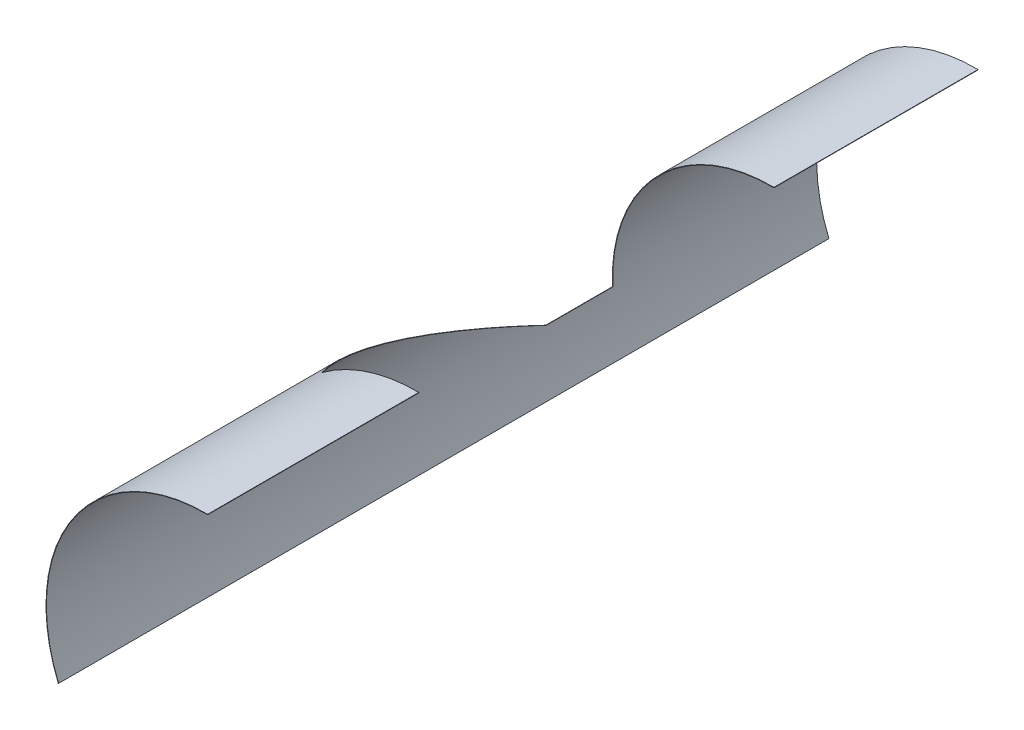
ISO-10303-21;
HEADER;
FILE_DESCRIPTION(('STEP AP214'),'2;1');
FILE_NAME('part.step','',(''),(''),'','','');
FILE_SCHEMA(('AUTOMOTIVE_DESIGN { 1 0 10303 214 1 1 1 1 }'));
ENDSEC;
DATA;
#1=APPLICATION_CONTEXT('core data for automotive mechanical design processes');
#2=APPLICATION_PROTOCOL_DEFINITION('international standard','automotive_design',2000,#1);
#3=PRODUCT_CONTEXT('',#1,'mechanical');
#4=PRODUCT('Part','Part','',(#3));
#5=PRODUCT_RELATED_PRODUCT_CATEGORY('part','',(#4));
#6=PRODUCT_DEFINITION_FORMATION('','',#4);
#7=PRODUCT_DEFINITION_CONTEXT('part definition',#1,'design');
#8=PRODUCT_DEFINITION('design','',#6,#7);
#9=PRODUCT_DEFINITION_SHAPE('','',#8);
#10=(LENGTH_UNIT() NAMED_UNIT(*) SI_UNIT(.MILLI.,.METRE.));
#11=(NAMED_UNIT(*) PLANE_ANGLE_UNIT() SI_UNIT($,.RADIAN.));
#12=(NAMED_UNIT(*) SI_UNIT($,.STERADIAN.) SOLID_ANGLE_UNIT());
#13=UNCERTAINTY_MEASURE_WITH_UNIT(LENGTH_MEASURE(1.E-05),#10,'distance_accuracy_value','');
#14=(GEOMETRIC_REPRESENTATION_CONTEXT(3) GLOBAL_UNCERTAINTY_ASSIGNED_CONTEXT((#13)) GLOBAL_UNIT_ASSIGNED_CONTEXT((#10,
#11,#12)) REPRESENTATION_CONTEXT('',''));
#15=CARTESIAN_POINT('',(0.,0.,0.));
#16=DIRECTION('',(0.,0.,1.));
#17=DIRECTION('',(1.,0.,0.));
#18=AXIS2_PLACEMENT_3D('',#15,#16,#17);
#19=CARTESIAN_POINT('',(0.,1.38777878078145E-13,2670.88598128334));
#20=DIRECTION('',(0.,0.,-1.));
#21=DIRECTION('',(1.,0.,0.));
#22=AXIS2_PLACEMENT_3D('',#19,#20,#21);
#23=CYLINDRICAL_SURFACE('',#22,406.);
#24=CARTESIAN_POINT('',(0.,1.38777878078145E-13,9.84573388113086));
#25=DIRECTION('',(0.,0.,1.));
#26=DIRECTION('',(1.,0.,0.));
#27=AXIS2_PLACEMENT_3D('',#24,#25,#26);
#28=CIRCLE('',#27,406.);
#29=CARTESIAN_POINT('',(4.99999999999997,405.969210655193,9.84573388113086));
#30=VERTEX_POINT('',#29);
#31=CARTESIAN_POINT('',(-374.794878018808,-156.092278511356,9.84573388113086));
#32=VERTEX_POINT('',#31);
#33=EDGE_CURVE('E131',#30,#32,#28,.T.);
#34=ORIENTED_EDGE('',*,*,#33,.F.);
#35=DIRECTION('',(0.,0.,-1.));
#36=VECTOR('',#35,1.);
#37=CARTESIAN_POINT('',(4.99999999999997,405.969210655193,2670.88598128334));
#38=LINE('',#37,#36);
#39=CARTESIAN_POINT('',(4.99999999999997,405.969210655193,529.845733881131));
#40=VERTEX_POINT('',#39);
#41=EDGE_CURVE('E123',#40,#30,#38,.T.);
#42=ORIENTED_EDGE('',*,*,#41,.F.);
#43=CARTESIAN_POINT('',(0.,1.38777878078145E-13,529.845733881131));
#44=DIRECTION('',(0.,0.,-1.));
#45=DIRECTION('',(0.,1.,0.));
#46=AXIS2_PLACEMENT_3D('',#43,#44,#45);
#47=CIRCLE('',#46,406.);
#48=CARTESIAN_POINT('',(-405.599418023298,-18.0308651806321,529.845733881131));
#49=VERTEX_POINT('',#48);
#50=EDGE_CURVE('E168',#49,#40,#47,.T.);
#51=ORIENTED_EDGE('',*,*,#50,.F.);
#52=DIRECTION('',(0.,0.,-1.));
#53=VECTOR('',#52,1.);
#54=CARTESIAN_POINT('',(-405.599418023298,-18.0308651806318,2670.88598128334));
#55=LINE('',#54,#53);
#56=CARTESIAN_POINT('',(-405.599418023298,-18.0308651806321,699.845733881131));
#57=VERTEX_POINT('',#56);
#58=EDGE_CURVE('E165',#57,#49,#55,.T.);
#59=ORIENTED_EDGE('',*,*,#58,.F.);
#60=CARTESIAN_POINT('',(0.,1.38777878078145E-13,738.259316222479));
#61=DIRECTION('',(0.,-0.905236944073035,0.424907137013856));
#62=DIRECTION('',(0.,-0.424907137013856,-0.905236944073035));
#63=AXIS2_PLACEMENT_3D('',#60,#61,#62);
#64=ELLIPSE('',#63,955.50289612283,406.);
#65=CARTESIAN_POINT('',(-406.,1.38777878078145E-13,738.259316222479));
#66=VERTEX_POINT('',#65);
#67=EDGE_CURVE('E162',#66,#57,#64,.T.);
#68=ORIENTED_EDGE('',*,*,#67,.F.);
#69=CARTESIAN_POINT('',(0.,1.38777878078145E-13,738.259316222479));
#70=DIRECTION('',(0.,-0.905638282548148,0.424051059641692));
#71=DIRECTION('',(0.,-0.424051059641692,-0.905638282548148));
#72=AXIS2_PLACEMENT_3D('',#69,#70,#71);
#73=ELLIPSE('',#72,957.431872338807,406.);
#74=CARTESIAN_POINT('',(-241.768256652279,326.165770851753,1434.84573388116));
#75=VERTEX_POINT('',#74);
#76=EDGE_CURVE('E182',#75,#66,#73,.T.);
#77=ORIENTED_EDGE('',*,*,#76,.F.);
#78=CARTESIAN_POINT('',(0.,1.38777878078145E-13,1434.84573388116));
#79=DIRECTION('',(0.,0.,1.));
#80=DIRECTION('',(0.,-1.,0.));
#81=AXIS2_PLACEMENT_3D('',#78,#79,#80);
#82=CIRCLE('',#81,406.);
#83=CARTESIAN_POINT('',(4.99999999999997,405.969210655193,1434.84573388116));
#84=VERTEX_POINT('',#83);
#85=EDGE_CURVE('E159',#84,#75,#82,.T.);
#86=ORIENTED_EDGE('',*,*,#85,.F.);
#87=CARTESIAN_POINT('',(4.99999999999997,405.969210655193,1972.84573388114));
#88=VERTEX_POINT('',#87);
#89=EDGE_CURVE('E41',#88,#84,#38,.T.);
#90=ORIENTED_EDGE('',*,*,#89,.F.);
#91=CARTESIAN_POINT('',(0.,1.38777878078145E-13,1972.84573388114));
#92=DIRECTION('',(0.,0.,-1.));
#93=DIRECTION('',(-1.,0.,0.));
#94=AXIS2_PLACEMENT_3D('',#91,#92,#93);
#95=CIRCLE('',#94,406.);
#96=CARTESIAN_POINT('',(-374.794878018808,-156.092278511356,1972.84573388114));
#97=VERTEX_POINT('',#96);
#98=EDGE_CURVE('E147',#97,#88,#95,.T.);
#99=ORIENTED_EDGE('',*,*,#98,.F.);
#100=DIRECTION('',(0.,0.,-1.));
#101=VECTOR('',#100,1.);
#102=CARTESIAN_POINT('',(-374.794878018808,-156.092278511356,2670.88598128334));
#103=LINE('',#102,#101);
#104=EDGE_CURVE('E11',#97,#32,#103,.T.);
#105=ORIENTED_EDGE('',*,*,#104,.T.);
#106=EDGE_LOOP('',(#34,#42,#51,#59,#68,#77,#86,#90,#99,#105));
#107=FACE_BOUND('',#106,.T.);
#108=ADVANCED_FACE('F37',(#107),#23,.F.);
#109=CARTESIAN_POINT('',(0.,1.38777878078145E-13,2670.88598128334));
#110=DIRECTION('',(0.,0.,-1.));
#111=DIRECTION('',(1.,0.,0.));
#112=AXIS2_PLACEMENT_3D('',#109,#110,#111);
#113=CYLINDRICAL_SURFACE('',#112,407.);
#114=DIRECTION('',(0.,0.,-1.));
#115=VECTOR('',#114,1.);
#116=CARTESIAN_POINT('',(-375.71801811245,-156.476742251532,2670.88598128334));
#117=LINE('',#116,#115);
#118=CARTESIAN_POINT('',(-375.71801811245,-156.476742251532,1972.84573388114));
#119=VERTEX_POINT('',#118);
#120=CARTESIAN_POINT('',(-375.71801811245,-156.476742251532,9.84573388113086));
#121=VERTEX_POINT('',#120);
#122=EDGE_CURVE('E46',#119,#121,#117,.T.);
#123=ORIENTED_EDGE('',*,*,#122,.F.);
#124=CARTESIAN_POINT('',(0.,1.38777878078145E-13,1972.84573388114));
#125=DIRECTION('',(0.,0.,1.));
#126=DIRECTION('',(1.,0.,0.));
#127=AXIS2_PLACEMENT_3D('',#124,#125,#126);
#128=CIRCLE('',#127,407.);
#129=CARTESIAN_POINT('',(5.01231527093589,406.969134819368,1972.84573388114));
#130=VERTEX_POINT('',#129);
#131=EDGE_CURVE('E141',#130,#119,#128,.T.);
#132=ORIENTED_EDGE('',*,*,#131,.F.);
#133=DIRECTION('',(0.,0.,-1.));
#134=VECTOR('',#133,1.);
#135=CARTESIAN_POINT('',(5.01231527093589,406.969134819368,2670.88598128334));
#136=LINE('',#135,#134);
#137=CARTESIAN_POINT('',(5.01231527093589,406.969134819368,1434.84573388116));
#138=VERTEX_POINT('',#137);
#139=EDGE_CURVE('E136',#130,#138,#136,.T.);
#140=ORIENTED_EDGE('',*,*,#139,.T.);
#141=CARTESIAN_POINT('',(0.,1.38777878078145E-13,1434.84573388116));
#142=DIRECTION('',(0.,0.,1.));
#143=DIRECTION('',(1.,0.,0.));
#144=AXIS2_PLACEMENT_3D('',#141,#142,#143);
#145=CIRCLE('',#144,407.);
#146=CARTESIAN_POINT('',(-242.363744969156,326.969134819368,1434.84573388116));
#147=VERTEX_POINT('',#146);
#148=EDGE_CURVE('E154',#138,#147,#145,.T.);
#149=ORIENTED_EDGE('',*,*,#148,.T.);
#150=CARTESIAN_POINT('',(0.,1.38777878078145E-13,738.259316222479));
#151=DIRECTION('',(0.,-0.905236944073035,0.424907137013856));
#152=DIRECTION('',(0.,-0.424907137013856,-0.905236944073035));
#153=AXIS2_PLACEMENT_3D('',#150,#151,#152);
#154=ELLIPSE('',#153,957.856351532,407.);
#155=CARTESIAN_POINT('',(-407.,-3.23675326903691E-11,738.25931622241));
#156=VERTEX_POINT('',#155);
#157=EDGE_CURVE('E183',#147,#156,#154,.T.);
#158=ORIENTED_EDGE('',*,*,#157,.T.);
#159=CARTESIAN_POINT('',(0.,1.38777878078145E-13,738.259316222479));
#160=DIRECTION('',(0.,-0.904834163168262,0.425764180226086));
#161=DIRECTION('',(0.,-0.425764180226086,-0.904834163168262));
#162=AXIS2_PLACEMENT_3D('',#159,#160,#161);
#163=ELLIPSE('',#162,955.928231876806,407.);
#164=CARTESIAN_POINT('',(-406.598431368183,-18.0752761786137,699.845733881131));
#165=VERTEX_POINT('',#164);
#166=EDGE_CURVE('E173',#156,#165,#163,.T.);
#167=ORIENTED_EDGE('',*,*,#166,.T.);
#168=DIRECTION('',(0.,0.,-1.));
#169=VECTOR('',#168,1.);
#170=CARTESIAN_POINT('',(-406.598431368183,-18.0752761786135,2670.88598128334));
#171=LINE('',#170,#169);
#172=CARTESIAN_POINT('',(-406.598431368183,-18.0752761786139,529.845733881131));
#173=VERTEX_POINT('',#172);
#174=EDGE_CURVE('E171',#165,#173,#171,.T.);
#175=ORIENTED_EDGE('',*,*,#174,.T.);
#176=CARTESIAN_POINT('',(0.,1.38777878078145E-13,529.845733881131));
#177=DIRECTION('',(0.,0.,1.));
#178=DIRECTION('',(1.,0.,0.));
#179=AXIS2_PLACEMENT_3D('',#176,#177,#178);
#180=CIRCLE('',#179,407.);
#181=CARTESIAN_POINT('',(5.01231527093589,406.969134819368,529.845733881131));
#182=VERTEX_POINT('',#181);
#183=EDGE_CURVE('E135',#173,#182,#180,.F.);
#184=ORIENTED_EDGE('',*,*,#183,.T.);
#185=CARTESIAN_POINT('',(5.01231527093589,406.969134819368,9.84573388113086));
#186=VERTEX_POINT('',#185);
#187=EDGE_CURVE('E120',#182,#186,#136,.T.);
#188=ORIENTED_EDGE('',*,*,#187,.T.);
#189=CARTESIAN_POINT('',(0.,1.38777878078145E-13,9.84573388113086));
#190=DIRECTION('',(0.,0.,1.));
#191=DIRECTION('',(1.,0.,0.));
#192=AXIS2_PLACEMENT_3D('',#189,#190,#191);
#193=CIRCLE('',#192,407.);
#194=EDGE_CURVE('E125',#186,#121,#193,.T.);
#195=ORIENTED_EDGE('',*,*,#194,.T.);
#196=EDGE_LOOP('',(#123,#132,#140,#149,#158,#167,#175,#184,#188,#195));
#197=FACE_BOUND('',#196,.T.);
#198=ADVANCED_FACE('F133',(#197),#113,.T.);
#199=CARTESIAN_POINT('',(5.01231527093589,406.969134819368,2670.88598128334));
#200=DIRECTION('',(-0.999924164175351,0.0123152709359198,0.));
#201=DIRECTION('',(-0.0123152709359198,-0.999924164175351,0.));
#202=AXIS2_PLACEMENT_3D('',#199,#200,#201);
#203=PLANE('',#202);
#204=DIRECTION('',(-0.0123152709359605,-0.999924164175351,0.));
#205=VECTOR('',#204,1.);
#206=CARTESIAN_POINT('',(4.99999999999997,405.969210655193,9.84573388113086));
#207=LINE('',#206,#205);
#208=EDGE_CURVE('E117',#30,#186,#207,.F.);
#209=ORIENTED_EDGE('',*,*,#208,.T.);
#210=ORIENTED_EDGE('',*,*,#187,.F.);
#211=DIRECTION('',(-0.0123152709359605,-0.999924164175351,0.));
#212=VECTOR('',#211,1.);
#213=CARTESIAN_POINT('',(4.99999999999997,405.969210655193,529.845733881131));
#214=LINE('',#213,#212);
#215=EDGE_CURVE('E62',#40,#182,#214,.F.);
#216=ORIENTED_EDGE('',*,*,#215,.F.);
#217=ORIENTED_EDGE('',*,*,#41,.T.);
#218=EDGE_LOOP('',(#209,#210,#216,#217));
#219=FACE_BOUND('',#218,.T.);
#220=ADVANCED_FACE('F118',(#219),#203,.F.);
#221=CARTESIAN_POINT('',(-374.794878018808,-156.092278511356,2670.88598128334));
#222=DIRECTION('',(-0.384463740175602,0.923140093642448,0.));
#223=DIRECTION('',(-0.923140093642448,-0.384463740175602,0.));
#224=AXIS2_PLACEMENT_3D('',#221,#222,#223);
#225=PLANE('',#224);
#226=DIRECTION('',(-0.923140093642385,-0.384463740175754,0.));
#227=VECTOR('',#226,1.);
#228=CARTESIAN_POINT('',(-375.718018112451,-156.476742251532,9.84573388113086));
#229=LINE('',#228,#227);
#230=EDGE_CURVE('E54',#121,#32,#229,.F.);
#231=ORIENTED_EDGE('',*,*,#230,.T.);
#232=ORIENTED_EDGE('',*,*,#104,.F.);
#233=DIRECTION('',(0.923140093642384,0.384463740175754,0.));
#234=VECTOR('',#233,1.);
#235=CARTESIAN_POINT('',(-374.794878018808,-156.092278511356,1972.84573388114));
#236=LINE('',#235,#234);
#237=EDGE_CURVE('E145',#97,#119,#236,.F.);
#238=ORIENTED_EDGE('',*,*,#237,.T.);
#239=ORIENTED_EDGE('',*,*,#122,.T.);
#240=EDGE_LOOP('',(#231,#232,#238,#239));
#241=FACE_BOUND('',#240,.T.);
#242=ADVANCED_FACE('F195',(#241),#225,.F.);
#243=DIRECTION('',(-0.0123152709359605,-0.999924164175351,0.));
#244=VECTOR('',#243,1.);
#245=CARTESIAN_POINT('',(4.99999999999997,405.969210655193,1434.84573388116));
#246=LINE('',#245,#244);
#247=EDGE_CURVE('E156',#84,#138,#246,.F.);
#248=ORIENTED_EDGE('',*,*,#247,.T.);
#249=ORIENTED_EDGE('',*,*,#139,.F.);
#250=DIRECTION('',(-0.0123152709359605,-0.999924164175351,0.));
#251=VECTOR('',#250,1.);
#252=CARTESIAN_POINT('',(4.99999999999997,405.969210655193,1972.84573388114));
#253=LINE('',#252,#251);
#254=EDGE_CURVE('E144',#88,#130,#253,.F.);
#255=ORIENTED_EDGE('',*,*,#254,.F.);
#256=ORIENTED_EDGE('',*,*,#89,.T.);
#257=EDGE_LOOP('',(#248,#249,#255,#256));
#258=FACE_BOUND('',#257,.T.);
#259=ADVANCED_FACE('F39',(#258),#203,.F.);
#260=CARTESIAN_POINT('',(0.,1.38777878078145E-13,1972.84573388114));
#261=DIRECTION('',(0.,0.,-1.));
#262=DIRECTION('',(1.,0.,0.));
#263=AXIS2_PLACEMENT_3D('',#260,#261,#262);
#264=PLANE('',#263);
#265=ORIENTED_EDGE('',*,*,#254,.T.);
#266=ORIENTED_EDGE('',*,*,#131,.T.);
#267=ORIENTED_EDGE('',*,*,#237,.F.);
#268=ORIENTED_EDGE('',*,*,#98,.T.);
#269=EDGE_LOOP('',(#265,#266,#267,#268));
#270=FACE_BOUND('',#269,.T.);
#271=ADVANCED_FACE('F199',(#270),#264,.F.);
#272=CARTESIAN_POINT('',(0.,1.38777878078145E-13,529.845733881131));
#273=DIRECTION('',(0.,0.,-1.));
#274=DIRECTION('',(0.,-1.,0.));
#275=AXIS2_PLACEMENT_3D('',#272,#273,#274);
#276=PLANE('',#275);
#277=ORIENTED_EDGE('',*,*,#50,.T.);
#278=ORIENTED_EDGE('',*,*,#215,.T.);
#279=ORIENTED_EDGE('',*,*,#183,.F.);
#280=DIRECTION('',(0.99901334488497,0.0444109979818527,0.));
#281=VECTOR('',#280,1.);
#282=CARTESIAN_POINT('',(-405.599418023298,-18.0308651806321,529.845733881131));
#283=LINE('',#282,#281);
#284=EDGE_CURVE('E152',#49,#173,#283,.F.);
#285=ORIENTED_EDGE('',*,*,#284,.F.);
#286=EDGE_LOOP('',(#277,#278,#279,#285));
#287=FACE_BOUND('',#286,.T.);
#288=ADVANCED_FACE('F217',(#287),#276,.F.);
#289=CARTESIAN_POINT('',(0.,1.38777878078145E-13,1434.84573388116));
#290=DIRECTION('',(0.,0.,1.));
#291=DIRECTION('',(0.,1.,0.));
#292=AXIS2_PLACEMENT_3D('',#289,#290,#291);
#293=PLANE('',#292);
#294=ORIENTED_EDGE('',*,*,#148,.F.);
#295=ORIENTED_EDGE('',*,*,#247,.F.);
#296=ORIENTED_EDGE('',*,*,#85,.T.);
#297=DIRECTION('',(-0.595488316877533,0.803363967615154,0.));
#298=VECTOR('',#297,1.);
#299=CARTESIAN_POINT('',(-242.363744969156,326.969134819368,1434.84573388116));
#300=LINE('',#299,#298);
#301=EDGE_CURVE('E170',#147,#75,#300,.F.);
#302=ORIENTED_EDGE('',*,*,#301,.F.);
#303=EDGE_LOOP('',(#294,#295,#296,#302));
#304=FACE_BOUND('',#303,.T.);
#305=ADVANCED_FACE('F204',(#304),#293,.F.);
#306=CARTESIAN_POINT('',(0.,-406.,-126.697205516687));
#307=CARTESIAN_POINT('',(0.,-406.333333333333,-126.697205516687));
#308=CARTESIAN_POINT('',(0.,-406.666666666667,-126.697205516687));
#309=CARTESIAN_POINT('',(0.,-407.,-126.697205516687));
#310=CARTESIAN_POINT('',(812.,-406.,-126.697205516687));
#311=CARTESIAN_POINT('',(812.666666666667,-406.333333333333,-126.697205516687));
#312=CARTESIAN_POINT('',(813.333333333333,-406.666666666667,-126.697205516687));
#313=CARTESIAN_POINT('',(814.,-407.,-126.697205516687));
#314=CARTESIAN_POINT('',(812.,406.,1603.21583796165));
#315=CARTESIAN_POINT('',(812.666666666667,406.333333333333,1603.21583796165));
#316=CARTESIAN_POINT('',(813.333333333333,406.666666666667,1603.21583796165));
#317=CARTESIAN_POINT('',(814.,407.,1603.21583796165));
#318=CARTESIAN_POINT('',(0.,406.,1603.21583796165));
#319=CARTESIAN_POINT('',(0.,406.333333333333,1603.21583796164));
#320=CARTESIAN_POINT('',(0.,406.666666666667,1603.21583796165));
#321=CARTESIAN_POINT('',(0.,407.,1603.21583796165));
#322=CARTESIAN_POINT('',(-812.,406.,1603.21583796165));
#323=CARTESIAN_POINT('',(-812.666666666667,406.333333333334,1603.21583796165));
#324=CARTESIAN_POINT('',(-813.333333333333,406.666666666667,1603.21583796165));
#325=CARTESIAN_POINT('',(-814.,407.,1603.21583796165));
#326=CARTESIAN_POINT('',(-812.,-406.,-126.697205516687));
#327=CARTESIAN_POINT('',(-812.666666666667,-406.333333333333,-126.697205516687));
#328=CARTESIAN_POINT('',(-813.333333333333,-406.666666666667,-126.697205516687));
#329=CARTESIAN_POINT('',(-814.,-407.,-126.697205516687));
#330=CARTESIAN_POINT('',(0.,-406.,-126.697205516687));
#331=CARTESIAN_POINT('',(0.,-406.333333333333,-126.697205516687));
#332=CARTESIAN_POINT('',(0.,-406.666666666667,-126.697205516687));
#333=CARTESIAN_POINT('',(0.,-407.,-126.697205516687));
#334=(BOUNDED_SURFACE() B_SPLINE_SURFACE(3,3,((#306,#307,#308,#309),(#310,#311,#312,#313),(#314,
#315,#316,#317),(#318,#319,#320,#321),(#322,#323,#324,#325),(#326,#327,#328,#329),(#330,#331,
#332,#333)),.UNSPECIFIED.,.T.,.F.,.F.) B_SPLINE_SURFACE_WITH_KNOTS((4,3,4),(4,4),(0.,0.5,1.),
(0.,1.),.UNSPECIFIED.) GEOMETRIC_REPRESENTATION_ITEM() RATIONAL_B_SPLINE_SURFACE(((1.,1.,1.,1.),
(0.333333333333333,0.333333333333333,0.333333333333333,0.333333333333333),(0.333333333333333,
0.333333333333333,0.333333333333333,0.333333333333333),(1.,1.,1.,1.),(0.333333333333333,
0.333333333333333,0.333333333333333,0.333333333333333),(0.333333333333333,0.333333333333333,
0.333333333333333,0.333333333333333),(1.,1.,1.,1.))) REPRESENTATION_ITEM('') SURFACE());
#335=DIRECTION('',(-1.,0.,0.));
#336=VECTOR('',#335,1.);
#337=CARTESIAN_POINT('',(-407.,1.52655665885959E-13,738.259316222479));
#338=LINE('',#337,#336);
#339=EDGE_CURVE('E180',#156,#66,#338,.F.);
#340=DIRECTION('',(0.99901334488497,0.0444109979818527,0.));
#341=VECTOR('',#340,1.);
#342=CARTESIAN_POINT('',(-405.599418023298,-18.0308651806321,699.845733881131));
#343=LINE('',#342,#341);
#344=EDGE_CURVE('E151',#57,#165,#343,.F.);
#345=ORIENTED_EDGE('',*,*,#339,.T.);
#346=ORIENTED_EDGE('',*,*,#67,.T.);
#347=ORIENTED_EDGE('',*,*,#344,.T.);
#348=ORIENTED_EDGE('',*,*,#166,.F.);
#349=EDGE_LOOP('',(#345,#346,#347,#348));
#350=FACE_BOUND('',#349,.T.);
#351=ADVANCED_FACE('F212',(#350),#334,.T.);
#352=CARTESIAN_POINT('',(-405.599418023298,-18.0308651806318,614.845733881131));
#353=DIRECTION('',(0.0444109979818521,-0.99901334488497,0.));
#354=DIRECTION('',(0.,0.,-1.));
#355=AXIS2_PLACEMENT_3D('',#352,#353,#354);
#356=PLANE('',#355);
#357=ORIENTED_EDGE('',*,*,#58,.T.);
#358=ORIENTED_EDGE('',*,*,#284,.T.);
#359=ORIENTED_EDGE('',*,*,#174,.F.);
#360=ORIENTED_EDGE('',*,*,#344,.F.);
#361=EDGE_LOOP('',(#357,#358,#359,#360));
#362=FACE_BOUND('',#361,.T.);
#363=ADVANCED_FACE('F216',(#362),#356,.F.);
#364=CARTESIAN_POINT('',(0.,-406.,-128.827640299295));
#365=CARTESIAN_POINT('',(0.,-406.333333333333,-128.827640299295));
#366=CARTESIAN_POINT('',(0.,-406.666666666667,-128.827640299295));
#367=CARTESIAN_POINT('',(0.,-407.,-128.827640299295));
#368=CARTESIAN_POINT('',(812.,-406.,-128.827640299295));
#369=CARTESIAN_POINT('',(812.666666666667,-406.333333333333,-128.827640299295));
#370=CARTESIAN_POINT('',(813.333333333333,-406.666666666667,-128.827640299295));
#371=CARTESIAN_POINT('',(814.,-407.,-128.827640299295));
#372=CARTESIAN_POINT('',(812.,406.,1605.34627274425));
#373=CARTESIAN_POINT('',(812.666666666667,406.333333333333,1605.34627274425));
#374=CARTESIAN_POINT('',(813.333333333333,406.666666666667,1605.34627274425));
#375=CARTESIAN_POINT('',(814.,407.,1605.34627274425));
#376=CARTESIAN_POINT('',(0.,406.,1605.34627274425));
#377=CARTESIAN_POINT('',(0.,406.333333333333,1605.34627274425));
#378=CARTESIAN_POINT('',(0.,406.666666666667,1605.34627274425));
#379=CARTESIAN_POINT('',(0.,407.,1605.34627274425));
#380=CARTESIAN_POINT('',(-812.,406.,1605.34627274425));
#381=CARTESIAN_POINT('',(-812.666666666667,406.333333333334,1605.34627274425));
#382=CARTESIAN_POINT('',(-813.333333333333,406.666666666667,1605.34627274425));
#383=CARTESIAN_POINT('',(-814.,407.,1605.34627274425));
#384=CARTESIAN_POINT('',(-812.,-406.,-128.827640299295));
#385=CARTESIAN_POINT('',(-812.666666666667,-406.333333333333,-128.827640299295));
#386=CARTESIAN_POINT('',(-813.333333333333,-406.666666666667,-128.827640299295));
#387=CARTESIAN_POINT('',(-814.,-407.,-128.827640299295));
#388=CARTESIAN_POINT('',(0.,-406.,-128.827640299295));
#389=CARTESIAN_POINT('',(0.,-406.333333333333,-128.827640299295));
#390=CARTESIAN_POINT('',(0.,-406.666666666667,-128.827640299295));
#391=CARTESIAN_POINT('',(0.,-407.,-128.827640299295));
#392=(BOUNDED_SURFACE() B_SPLINE_SURFACE(3,3,((#364,#365,#366,#367),(#368,#369,#370,#371),(#372,
#373,#374,#375),(#376,#377,#378,#379),(#380,#381,#382,#383),(#384,#385,#386,#387),(#388,#389,
#390,#391)),.UNSPECIFIED.,.T.,.F.,.F.) B_SPLINE_SURFACE_WITH_KNOTS((4,3,4),(4,4),(0.,0.5,1.),
(0.,1.),.UNSPECIFIED.) GEOMETRIC_REPRESENTATION_ITEM() RATIONAL_B_SPLINE_SURFACE(((1.,1.,1.,1.),
(0.333333333333333,0.333333333333333,0.333333333333333,0.333333333333333),(0.333333333333333,
0.333333333333333,0.333333333333333,0.333333333333333),(1.,1.,1.,1.),(0.333333333333333,
0.333333333333333,0.333333333333333,0.333333333333333),(0.333333333333333,0.333333333333333,
0.333333333333333,0.333333333333333),(1.,1.,1.,1.))) REPRESENTATION_ITEM('') SURFACE());
#393=ORIENTED_EDGE('',*,*,#301,.T.);
#394=ORIENTED_EDGE('',*,*,#76,.T.);
#395=ORIENTED_EDGE('',*,*,#339,.F.);
#396=ORIENTED_EDGE('',*,*,#157,.F.);
#397=EDGE_LOOP('',(#393,#394,#395,#396));
#398=FACE_BOUND('',#397,.T.);
#399=ADVANCED_FACE('F208',(#398),#392,.T.);
#400=CARTESIAN_POINT('',(0.,1.38777878078145E-13,9.84573388113086));
#401=DIRECTION('',(0.,0.,1.));
#402=DIRECTION('',(-1.,0.,0.));
#403=AXIS2_PLACEMENT_3D('',#400,#401,#402);
#404=PLANE('',#403);
#405=ORIENTED_EDGE('',*,*,#33,.T.);
#406=ORIENTED_EDGE('',*,*,#230,.F.);
#407=ORIENTED_EDGE('',*,*,#194,.F.);
#408=ORIENTED_EDGE('',*,*,#208,.F.);
#409=EDGE_LOOP('',(#405,#406,#407,#408));
#410=FACE_BOUND('',#409,.T.);
#411=ADVANCED_FACE('F127',(#410),#404,.F.);
#412=CLOSED_SHELL('',(#108,#198,#220,#242,#259,#271,#288,#305,#351,#363,#399,#411));
#413=MANIFOLD_SOLID_BREP('B2',#412);
#414=ADVANCED_BREP_SHAPE_REPRESENTATION('',(#18,#413),#14);
#415=SHAPE_DEFINITION_REPRESENTATION(#9,#414);
ENDSEC;
END-ISO-10303-21;
